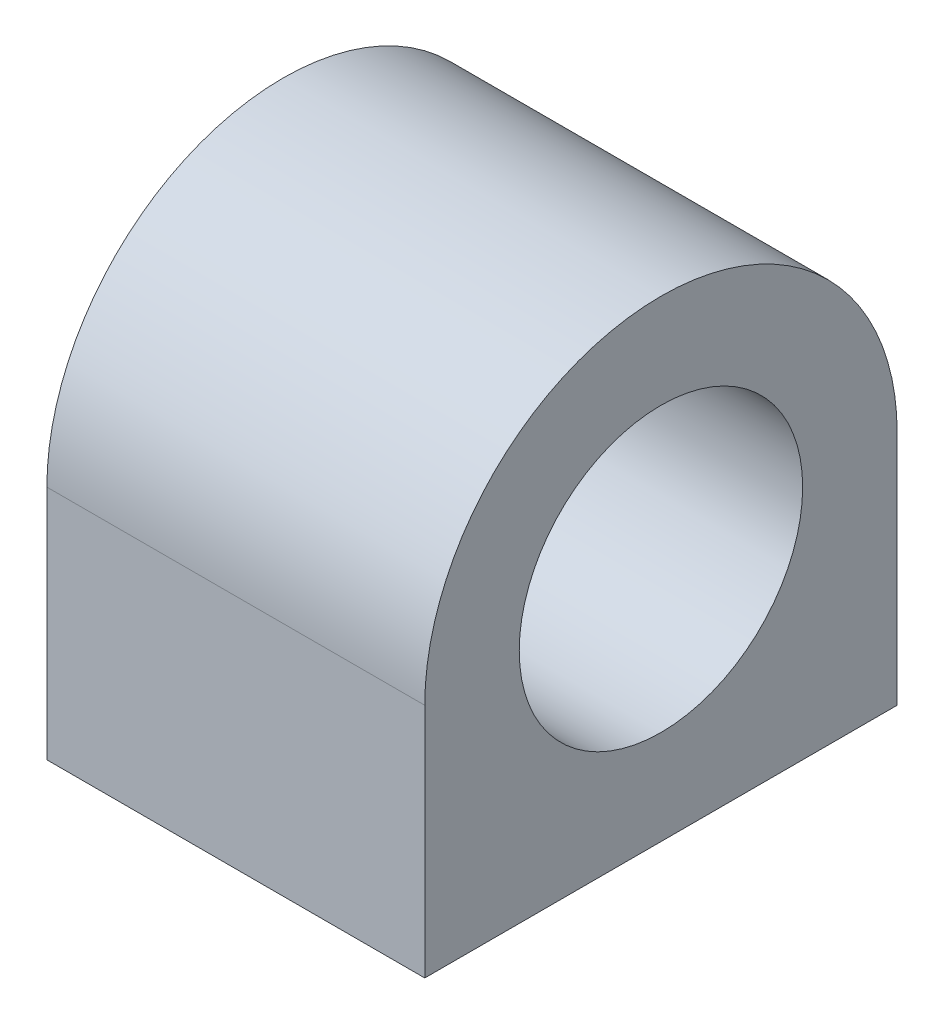
ISO-10303-21;
HEADER;
FILE_DESCRIPTION(('STEP AP214'),'2;1');
FILE_NAME('part.step','',(''),(''),'','','');
FILE_SCHEMA(('AUTOMOTIVE_DESIGN { 1 0 10303 214 1 1 1 1 }'));
ENDSEC;
DATA;
#1=APPLICATION_CONTEXT('core data for automotive mechanical design processes');
#2=APPLICATION_PROTOCOL_DEFINITION('international standard','automotive_design',2000,#1);
#3=PRODUCT_CONTEXT('',#1,'mechanical');
#4=PRODUCT('Part','Part','',(#3));
#5=PRODUCT_RELATED_PRODUCT_CATEGORY('part','',(#4));
#6=PRODUCT_DEFINITION_FORMATION('','',#4);
#7=PRODUCT_DEFINITION_CONTEXT('part definition',#1,'design');
#8=PRODUCT_DEFINITION('design','',#6,#7);
#9=PRODUCT_DEFINITION_SHAPE('','',#8);
#10=(LENGTH_UNIT() NAMED_UNIT(*) SI_UNIT(.MILLI.,.METRE.));
#11=(NAMED_UNIT(*) PLANE_ANGLE_UNIT() SI_UNIT($,.RADIAN.));
#12=(NAMED_UNIT(*) SI_UNIT($,.STERADIAN.) SOLID_ANGLE_UNIT());
#13=UNCERTAINTY_MEASURE_WITH_UNIT(LENGTH_MEASURE(1.E-05),#10,'distance_accuracy_value','');
#14=(GEOMETRIC_REPRESENTATION_CONTEXT(3) GLOBAL_UNCERTAINTY_ASSIGNED_CONTEXT((#13)) GLOBAL_UNIT_ASSIGNED_CONTEXT((#10,
#11,#12)) REPRESENTATION_CONTEXT('',''));
#15=CARTESIAN_POINT('',(0.,0.,0.));
#16=DIRECTION('',(0.,0.,1.));
#17=DIRECTION('',(1.,0.,0.));
#18=AXIS2_PLACEMENT_3D('',#15,#16,#17);
#19=CARTESIAN_POINT('',(20.,0.,0.));
#20=DIRECTION('',(0.,1.,0.));
#21=DIRECTION('',(0.,0.,1.));
#22=AXIS2_PLACEMENT_3D('',#19,#20,#21);
#23=PLANE('',#22);
#24=CARTESIAN_POINT('',(10.,0.,-5.));
#25=DIRECTION('',(0.,-1.,0.));
#26=DIRECTION('',(0.,0.,-1.));
#27=AXIS2_PLACEMENT_3D('',#24,#25,#26);
#28=CIRCLE('',#27,2.1);
#29=CARTESIAN_POINT('',(10.,0.,-7.1));
#30=VERTEX_POINT('',#29);
#31=EDGE_CURVE('E204',#30,#30,#28,.T.);
#32=ORIENTED_EDGE('',*,*,#31,.F.);
#33=EDGE_LOOP('',(#32));
#34=FACE_BOUND('',#33,.T.);
#35=CARTESIAN_POINT('',(10.,0.,-20.));
#36=DIRECTION('',(0.,-1.,0.));
#37=DIRECTION('',(0.,0.,-1.));
#38=AXIS2_PLACEMENT_3D('',#35,#36,#37);
#39=CIRCLE('',#38,2.1);
#40=CARTESIAN_POINT('',(10.,0.,-22.1));
#41=VERTEX_POINT('',#40);
#42=EDGE_CURVE('E206',#41,#41,#39,.T.);
#43=ORIENTED_EDGE('',*,*,#42,.F.);
#44=EDGE_LOOP('',(#43));
#45=FACE_BOUND('',#44,.T.);
#46=DIRECTION('',(0.,0.,-1.));
#47=VECTOR('',#46,1.);
#48=CARTESIAN_POINT('',(0.,0.,0.));
#49=LINE('',#48,#47);
#50=CARTESIAN_POINT('',(0.,0.,0.));
#51=VERTEX_POINT('',#50);
#52=CARTESIAN_POINT('',(0.,0.,-25.));
#53=VERTEX_POINT('',#52);
#54=EDGE_CURVE('E106',#51,#53,#49,.T.);
#55=ORIENTED_EDGE('',*,*,#54,.T.);
#56=DIRECTION('',(-1.,0.,0.));
#57=VECTOR('',#56,1.);
#58=CARTESIAN_POINT('',(20.,0.,-25.));
#59=LINE('',#58,#57);
#60=CARTESIAN_POINT('',(20.,0.,-25.));
#61=VERTEX_POINT('',#60);
#62=EDGE_CURVE('E72',#61,#53,#59,.T.);
#63=ORIENTED_EDGE('',*,*,#62,.F.);
#64=DIRECTION('',(0.,0.,-1.));
#65=VECTOR('',#64,1.);
#66=CARTESIAN_POINT('',(20.,0.,0.));
#67=LINE('',#66,#65);
#68=CARTESIAN_POINT('',(20.,0.,0.));
#69=VERTEX_POINT('',#68);
#70=EDGE_CURVE('E96',#69,#61,#67,.T.);
#71=ORIENTED_EDGE('',*,*,#70,.F.);
#72=DIRECTION('',(-1.,0.,0.));
#73=VECTOR('',#72,1.);
#74=CARTESIAN_POINT('',(20.,0.,0.));
#75=LINE('',#74,#73);
#76=EDGE_CURVE('E119',#69,#51,#75,.T.);
#77=ORIENTED_EDGE('',*,*,#76,.T.);
#78=EDGE_LOOP('',(#55,#63,#71,#77));
#79=FACE_BOUND('',#78,.T.);
#80=ADVANCED_FACE('F68',(#34,#45,#79),#23,.F.);
#81=CARTESIAN_POINT('',(20.,0.,0.));
#82=DIRECTION('',(0.,0.,1.));
#83=DIRECTION('',(1.,0.,0.));
#84=AXIS2_PLACEMENT_3D('',#81,#82,#83);
#85=PLANE('',#84);
#86=DIRECTION('',(0.,1.,0.));
#87=VECTOR('',#86,1.);
#88=CARTESIAN_POINT('',(0.,0.,0.));
#89=LINE('',#88,#87);
#90=CARTESIAN_POINT('',(0.,12.5,0.));
#91=VERTEX_POINT('',#90);
#92=EDGE_CURVE('E129',#51,#91,#89,.T.);
#93=ORIENTED_EDGE('',*,*,#92,.F.);
#94=ORIENTED_EDGE('',*,*,#76,.F.);
#95=DIRECTION('',(0.,1.,0.));
#96=VECTOR('',#95,1.);
#97=CARTESIAN_POINT('',(20.,0.,0.));
#98=LINE('',#97,#96);
#99=CARTESIAN_POINT('',(20.,12.5,0.));
#100=VERTEX_POINT('',#99);
#101=EDGE_CURVE('E156',#69,#100,#98,.T.);
#102=ORIENTED_EDGE('',*,*,#101,.T.);
#103=DIRECTION('',(-1.,0.,0.));
#104=VECTOR('',#103,1.);
#105=CARTESIAN_POINT('',(20.,12.5,0.));
#106=LINE('',#105,#104);
#107=EDGE_CURVE('E78',#100,#91,#106,.T.);
#108=ORIENTED_EDGE('',*,*,#107,.T.);
#109=EDGE_LOOP('',(#93,#94,#102,#108));
#110=FACE_BOUND('',#109,.T.);
#111=ADVANCED_FACE('F133',(#110),#85,.T.);
#112=CARTESIAN_POINT('',(20.,12.5,-12.5));
#113=DIRECTION('',(-1.,0.,0.));
#114=DIRECTION('',(0.,0.,1.));
#115=AXIS2_PLACEMENT_3D('',#112,#113,#114);
#116=CYLINDRICAL_SURFACE('',#115,12.5);
#117=CARTESIAN_POINT('',(20.,12.5,-12.5));
#118=DIRECTION('',(1.,0.,0.));
#119=DIRECTION('',(0.,0.,-1.));
#120=AXIS2_PLACEMENT_3D('',#117,#118,#119);
#121=CIRCLE('',#120,12.5);
#122=CARTESIAN_POINT('',(20.,12.5,-25.));
#123=VERTEX_POINT('',#122);
#124=EDGE_CURVE('E131',#123,#100,#121,.T.);
#125=ORIENTED_EDGE('',*,*,#124,.F.);
#126=DIRECTION('',(-1.,0.,0.));
#127=VECTOR('',#126,1.);
#128=CARTESIAN_POINT('',(20.,12.5,-25.));
#129=LINE('',#128,#127);
#130=CARTESIAN_POINT('',(0.,12.5,-25.));
#131=VERTEX_POINT('',#130);
#132=EDGE_CURVE('E12',#123,#131,#129,.T.);
#133=ORIENTED_EDGE('',*,*,#132,.T.);
#134=CARTESIAN_POINT('',(0.,12.5,-12.5));
#135=DIRECTION('',(1.,0.,0.));
#136=DIRECTION('',(0.,0.,-1.));
#137=AXIS2_PLACEMENT_3D('',#134,#135,#136);
#138=CIRCLE('',#137,12.5);
#139=EDGE_CURVE('E135',#131,#91,#138,.T.);
#140=ORIENTED_EDGE('',*,*,#139,.T.);
#141=ORIENTED_EDGE('',*,*,#107,.F.);
#142=EDGE_LOOP('',(#125,#133,#140,#141));
#143=FACE_BOUND('',#142,.T.);
#144=ADVANCED_FACE('F160',(#143),#116,.T.);
#145=CARTESIAN_POINT('',(0.,0.,0.));
#146=DIRECTION('',(1.,0.,0.));
#147=DIRECTION('',(0.,0.,-1.));
#148=AXIS2_PLACEMENT_3D('',#145,#146,#147);
#149=PLANE('',#148);
#150=CARTESIAN_POINT('',(0.,12.5,-12.5));
#151=DIRECTION('',(-1.,0.,0.));
#152=DIRECTION('',(0.,0.,1.));
#153=AXIS2_PLACEMENT_3D('',#150,#151,#152);
#154=CIRCLE('',#153,7.5);
#155=CARTESIAN_POINT('',(0.,12.5,-5.));
#156=VERTEX_POINT('',#155);
#157=EDGE_CURVE('E144',#156,#156,#154,.T.);
#158=ORIENTED_EDGE('',*,*,#157,.F.);
#159=EDGE_LOOP('',(#158));
#160=FACE_BOUND('',#159,.T.);
#161=ORIENTED_EDGE('',*,*,#139,.F.);
#162=DIRECTION('',(0.,1.,0.));
#163=VECTOR('',#162,1.);
#164=CARTESIAN_POINT('',(0.,0.,-25.));
#165=LINE('',#164,#163);
#166=EDGE_CURVE('E130',#53,#131,#165,.T.);
#167=ORIENTED_EDGE('',*,*,#166,.F.);
#168=ORIENTED_EDGE('',*,*,#54,.F.);
#169=ORIENTED_EDGE('',*,*,#92,.T.);
#170=EDGE_LOOP('',(#161,#167,#168,#169));
#171=FACE_BOUND('',#170,.T.);
#172=ADVANCED_FACE('F128',(#160,#171),#149,.F.);
#173=CARTESIAN_POINT('',(20.,0.,0.));
#174=DIRECTION('',(1.,0.,0.));
#175=DIRECTION('',(0.,0.,-1.));
#176=AXIS2_PLACEMENT_3D('',#173,#174,#175);
#177=PLANE('',#176);
#178=CARTESIAN_POINT('',(20.,12.5,-12.5));
#179=DIRECTION('',(-1.,0.,0.));
#180=DIRECTION('',(0.,0.,1.));
#181=AXIS2_PLACEMENT_3D('',#178,#179,#180);
#182=CIRCLE('',#181,7.5);
#183=CARTESIAN_POINT('',(20.,12.5,-5.));
#184=VERTEX_POINT('',#183);
#185=EDGE_CURVE('E142',#184,#184,#182,.T.);
#186=ORIENTED_EDGE('',*,*,#185,.T.);
#187=EDGE_LOOP('',(#186));
#188=FACE_BOUND('',#187,.T.);
#189=ORIENTED_EDGE('',*,*,#124,.T.);
#190=ORIENTED_EDGE('',*,*,#101,.F.);
#191=ORIENTED_EDGE('',*,*,#70,.T.);
#192=DIRECTION('',(0.,1.,0.));
#193=VECTOR('',#192,1.);
#194=CARTESIAN_POINT('',(20.,0.,-25.));
#195=LINE('',#194,#193);
#196=EDGE_CURVE('E141',#61,#123,#195,.T.);
#197=ORIENTED_EDGE('',*,*,#196,.T.);
#198=EDGE_LOOP('',(#189,#190,#191,#197));
#199=FACE_BOUND('',#198,.T.);
#200=ADVANCED_FACE('F157',(#188,#199),#177,.T.);
#201=CARTESIAN_POINT('',(20.,0.,-25.));
#202=DIRECTION('',(0.,0.,1.));
#203=DIRECTION('',(1.,0.,0.));
#204=AXIS2_PLACEMENT_3D('',#201,#202,#203);
#205=PLANE('',#204);
#206=ORIENTED_EDGE('',*,*,#166,.T.);
#207=ORIENTED_EDGE('',*,*,#132,.F.);
#208=ORIENTED_EDGE('',*,*,#196,.F.);
#209=ORIENTED_EDGE('',*,*,#62,.T.);
#210=EDGE_LOOP('',(#206,#207,#208,#209));
#211=FACE_BOUND('',#210,.T.);
#212=ADVANCED_FACE('F70',(#211),#205,.F.);
#213=CARTESIAN_POINT('',(20.,12.5,-12.5));
#214=DIRECTION('',(-1.,0.,0.));
#215=DIRECTION('',(0.,0.,1.));
#216=AXIS2_PLACEMENT_3D('',#213,#214,#215);
#217=CYLINDRICAL_SURFACE('',#216,7.5);
#218=ORIENTED_EDGE('',*,*,#185,.F.);
#219=EDGE_LOOP('',(#218));
#220=FACE_BOUND('',#219,.T.);
#221=ORIENTED_EDGE('',*,*,#157,.T.);
#222=EDGE_LOOP('',(#221));
#223=FACE_BOUND('',#222,.T.);
#224=ADVANCED_FACE('F179',(#220,#223),#217,.F.);
#225=CARTESIAN_POINT('',(10.,5.,-20.));
#226=DIRECTION('',(0.,-1.,0.));
#227=DIRECTION('',(0.,0.,-1.));
#228=AXIS2_PLACEMENT_3D('',#225,#226,#227);
#229=CONICAL_SURFACE('',#228,2.1,1.02974425867665);
#230=CARTESIAN_POINT('',(10.,6.26180729995788,-20.));
#231=VERTEX_POINT('',#230);
#232=VERTEX_LOOP('',#231);
#233=FACE_BOUND('',#232,.T.);
#234=CARTESIAN_POINT('',(10.,5.,-20.));
#235=DIRECTION('',(0.,-1.,0.));
#236=DIRECTION('',(0.,0.,-1.));
#237=AXIS2_PLACEMENT_3D('',#234,#235,#236);
#238=CIRCLE('',#237,2.1);
#239=CARTESIAN_POINT('',(10.,5.,-22.1));
#240=VERTEX_POINT('',#239);
#241=EDGE_CURVE('E149',#240,#240,#238,.T.);
#242=ORIENTED_EDGE('',*,*,#241,.T.);
#243=EDGE_LOOP('',(#242));
#244=FACE_BOUND('',#243,.T.);
#245=ADVANCED_FACE('F182',(#233,#244),#229,.F.);
#246=CARTESIAN_POINT('',(10.,0.,-20.));
#247=DIRECTION('',(0.,-1.,0.));
#248=DIRECTION('',(0.,0.,-1.));
#249=AXIS2_PLACEMENT_3D('',#246,#247,#248);
#250=CYLINDRICAL_SURFACE('',#249,2.1);
#251=ORIENTED_EDGE('',*,*,#241,.F.);
#252=EDGE_LOOP('',(#251));
#253=FACE_BOUND('',#252,.T.);
#254=ORIENTED_EDGE('',*,*,#42,.T.);
#255=EDGE_LOOP('',(#254));
#256=FACE_BOUND('',#255,.T.);
#257=ADVANCED_FACE('F186',(#253,#256),#250,.F.);
#258=CARTESIAN_POINT('',(10.,5.,-5.));
#259=DIRECTION('',(0.,-1.,0.));
#260=DIRECTION('',(0.,0.,-1.));
#261=AXIS2_PLACEMENT_3D('',#258,#259,#260);
#262=CONICAL_SURFACE('',#261,2.1,1.02974425867665);
#263=CARTESIAN_POINT('',(10.,6.26180729995788,-5.));
#264=VERTEX_POINT('',#263);
#265=VERTEX_LOOP('',#264);
#266=FACE_BOUND('',#265,.T.);
#267=CARTESIAN_POINT('',(10.,5.,-5.));
#268=DIRECTION('',(0.,-1.,0.));
#269=DIRECTION('',(0.,0.,-1.));
#270=AXIS2_PLACEMENT_3D('',#267,#268,#269);
#271=CIRCLE('',#270,2.1);
#272=CARTESIAN_POINT('',(10.,5.,-7.1));
#273=VERTEX_POINT('',#272);
#274=EDGE_CURVE('E202',#273,#273,#271,.T.);
#275=ORIENTED_EDGE('',*,*,#274,.T.);
#276=EDGE_LOOP('',(#275));
#277=FACE_BOUND('',#276,.T.);
#278=ADVANCED_FACE('F189',(#266,#277),#262,.F.);
#279=CARTESIAN_POINT('',(10.,0.,-5.));
#280=DIRECTION('',(0.,-1.,0.));
#281=DIRECTION('',(0.,0.,-1.));
#282=AXIS2_PLACEMENT_3D('',#279,#280,#281);
#283=CYLINDRICAL_SURFACE('',#282,2.1);
#284=ORIENTED_EDGE('',*,*,#274,.F.);
#285=EDGE_LOOP('',(#284));
#286=FACE_BOUND('',#285,.T.);
#287=ORIENTED_EDGE('',*,*,#31,.T.);
#288=EDGE_LOOP('',(#287));
#289=FACE_BOUND('',#288,.T.);
#290=ADVANCED_FACE('F193',(#286,#289),#283,.F.);
#291=CLOSED_SHELL('',(#80,#111,#144,#172,#200,#212,#224,#245,#257,#278,#290));
#292=MANIFOLD_SOLID_BREP('B2',#291);
#293=ADVANCED_BREP_SHAPE_REPRESENTATION('',(#18,#292),#14);
#294=SHAPE_DEFINITION_REPRESENTATION(#9,#293);
ENDSEC;
END-ISO-10303-21;
